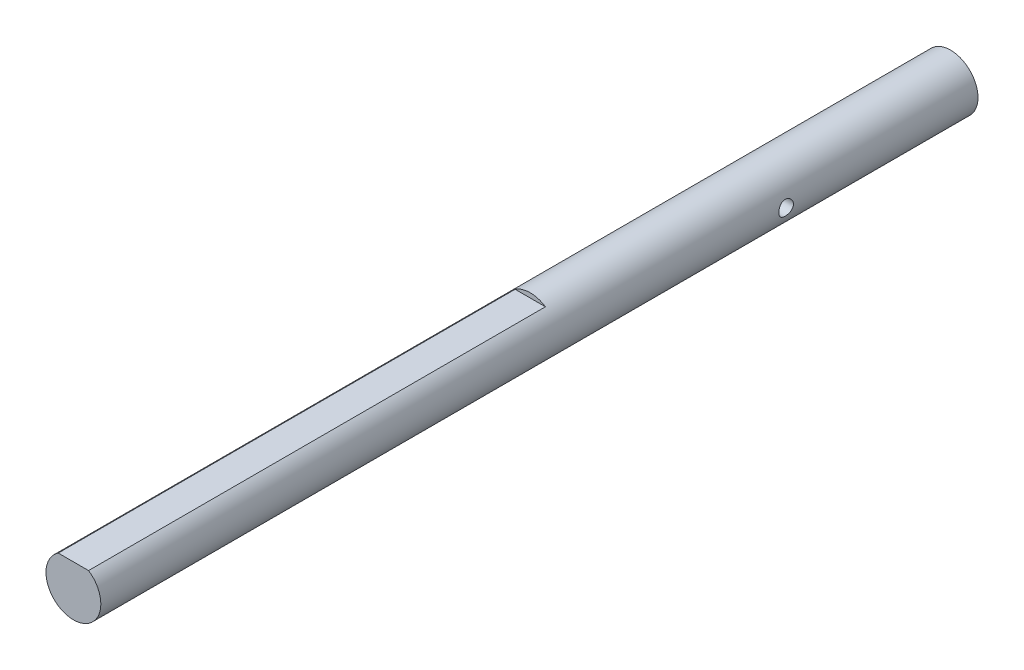
ISO-10303-21;
HEADER;
FILE_DESCRIPTION(('STEP AP214'),'2;1');
FILE_NAME('part.step','',(''),(''),'','','');
FILE_SCHEMA(('AUTOMOTIVE_DESIGN { 1 0 10303 214 1 1 1 1 }'));
ENDSEC;
DATA;
#1=APPLICATION_CONTEXT('core data for automotive mechanical design processes');
#2=APPLICATION_PROTOCOL_DEFINITION('international standard','automotive_design',2000,#1);
#3=PRODUCT_CONTEXT('',#1,'mechanical');
#4=PRODUCT('Part','Part','',(#3));
#5=PRODUCT_RELATED_PRODUCT_CATEGORY('part','',(#4));
#6=PRODUCT_DEFINITION_FORMATION('','',#4);
#7=PRODUCT_DEFINITION_CONTEXT('part definition',#1,'design');
#8=PRODUCT_DEFINITION('design','',#6,#7);
#9=PRODUCT_DEFINITION_SHAPE('','',#8);
#10=(LENGTH_UNIT() NAMED_UNIT(*) SI_UNIT(.MILLI.,.METRE.));
#11=(NAMED_UNIT(*) PLANE_ANGLE_UNIT() SI_UNIT($,.RADIAN.));
#12=(NAMED_UNIT(*) SI_UNIT($,.STERADIAN.) SOLID_ANGLE_UNIT());
#13=UNCERTAINTY_MEASURE_WITH_UNIT(LENGTH_MEASURE(1.E-05),#10,'distance_accuracy_value','');
#14=(GEOMETRIC_REPRESENTATION_CONTEXT(3) GLOBAL_UNCERTAINTY_ASSIGNED_CONTEXT((#13)) GLOBAL_UNIT_ASSIGNED_CONTEXT((#10,
#11,#12)) REPRESENTATION_CONTEXT('',''));
#15=CARTESIAN_POINT('',(0.,0.,0.));
#16=DIRECTION('',(0.,0.,1.));
#17=DIRECTION('',(1.,0.,0.));
#18=AXIS2_PLACEMENT_3D('',#15,#16,#17);
#19=CARTESIAN_POINT('',(0.,0.,-304.8));
#20=DIRECTION('',(0.,0.,1.));
#21=DIRECTION('',(1.,0.,0.));
#22=AXIS2_PLACEMENT_3D('',#19,#20,#21);
#23=CYLINDRICAL_SURFACE('',#22,9.525);
#24=CARTESIAN_POINT('',(-9.525,0.,-240.665));
#25=CARTESIAN_POINT('',(-9.52499788938906,-0.140023285907723,-240.664996676493));
#26=CARTESIAN_POINT('',(-9.52188197425932,-0.280082193481732,-240.653382529979));
#27=CARTESIAN_POINT('',(-9.50975458499507,-0.556165323220162,-240.607315036962));
#28=CARTESIAN_POINT('',(-9.50074027372385,-0.692187570815235,-240.572850699379));
#29=CARTESIAN_POINT('',(-9.47781103231044,-0.956172318087541,-240.482282983083));
#30=CARTESIAN_POINT('',(-9.46390242255576,-1.0841449627894,-240.426207503664));
#31=CARTESIAN_POINT('',(-9.43265447922631,-1.32886918171867,-240.294112701813));
#32=CARTESIAN_POINT('',(-9.41531491704878,-1.44562000747101,-240.218092050334));
#33=CARTESIAN_POINT('',(-9.37862760925533,-1.66729346974982,-240.046403934155));
#34=CARTESIAN_POINT('',(-9.35924553951925,-1.77191884612574,-239.95035999163));
#35=CARTESIAN_POINT('',(-9.32087810293081,-1.9637846634901,-239.74215642651));
#36=CARTESIAN_POINT('',(-9.30189278742998,-2.05102286639492,-239.629994732426));
#37=CARTESIAN_POINT('',(-9.26611732579753,-2.20708739739135,-239.390366741772));
#38=CARTESIAN_POINT('',(-9.24937048475314,-2.27557174725336,-239.262670663108));
#39=CARTESIAN_POINT('',(-9.22047276194098,-2.3899818605778,-238.997058058913));
#40=CARTESIAN_POINT('',(-9.20832103281647,-2.43591178363236,-238.859143423339));
#41=CARTESIAN_POINT('',(-9.19034377069047,-2.50287688687658,-238.580300666962));
#42=CARTESIAN_POINT('',(-9.18438152720593,-2.52445101210757,-238.439511004288));
#43=CARTESIAN_POINT('',(-9.17904985263791,-2.54377234076389,-238.156194142201));
#44=CARTESIAN_POINT('',(-9.17967918968346,-2.54152399626305,-238.013667272419));
#45=CARTESIAN_POINT('',(-9.18733721078579,-2.51369207703426,-237.735128522475));
#46=CARTESIAN_POINT('',(-9.19418704099645,-2.48876065702249,-237.599045778811));
#47=CARTESIAN_POINT('',(-9.21322786612474,-2.4173148087717,-237.333068215241));
#48=CARTESIAN_POINT('',(-9.22541928791818,-2.37079865556101,-237.203173890804));
#49=CARTESIAN_POINT('',(-9.2539269042045,-2.25697233345874,-236.951560457363));
#50=CARTESIAN_POINT('',(-9.27028807379753,-2.18943353244986,-236.829950089107));
#51=CARTESIAN_POINT('',(-9.30526751645905,-2.03563859856197,-236.599559618259));
#52=CARTESIAN_POINT('',(-9.32388623351087,-1.94937878124798,-236.490782047771));
#53=CARTESIAN_POINT('',(-9.36202738499927,-1.75725591224541,-236.285418973232));
#54=CARTESIAN_POINT('',(-9.38155948790815,-1.6508452216494,-236.18934687574));
#55=CARTESIAN_POINT('',(-9.41878204220921,-1.4231844386221,-236.016306248955));
#56=CARTESIAN_POINT('',(-9.43647242100464,-1.30193376164047,-235.939338472548));
#57=CARTESIAN_POINT('',(-9.46812711905832,-1.04723978448177,-235.806465263413));
#58=CARTESIAN_POINT('',(-9.48207492498621,-0.913745826240774,-235.75065274153));
#59=CARTESIAN_POINT('',(-9.50455356389269,-0.638812913875803,-235.662410070207));
#60=CARTESIAN_POINT('',(-9.51308558051861,-0.497375703148972,-235.629974811341));
#61=CARTESIAN_POINT('',(-9.52359231369148,-0.214952685594806,-235.590213506314));
#62=CARTESIAN_POINT('',(-9.52574926788118,-0.0740717818045559,-235.582189439389));
#63=CARTESIAN_POINT('',(-9.52378679048453,0.207022758294517,-235.589550618594));
#64=CARTESIAN_POINT('',(-9.51966800762049,0.347236462068877,-235.604933445154));
#65=CARTESIAN_POINT('',(-9.50573455079945,0.620525111375258,-235.658099228274));
#66=CARTESIAN_POINT('',(-9.49601893713836,0.753681312075287,-235.695492852671));
#67=CARTESIAN_POINT('',(-9.47199394515559,1.01181785339361,-235.791166649525));
#68=CARTESIAN_POINT('',(-9.45768406905135,1.13679730630435,-235.849449085338));
#69=CARTESIAN_POINT('',(-9.42563088910591,1.37774486282828,-235.986540836719));
#70=CARTESIAN_POINT('',(-9.40782581988256,1.49348848934568,-236.065729882833));
#71=CARTESIAN_POINT('',(-9.37084044504306,1.71028948695436,-236.241909570301));
#72=CARTESIAN_POINT('',(-9.35165986824099,1.81134395007495,-236.338903727903));
#73=CARTESIAN_POINT('',(-9.31341477250563,1.9988393408804,-236.551197683418));
#74=CARTESIAN_POINT('',(-9.29436878014651,2.08478779447261,-236.666936572972));
#75=CARTESIAN_POINT('',(-9.2591438792264,2.23605332805101,-236.911597164046));
#76=CARTESIAN_POINT('',(-9.24296485106674,2.30137126875155,-237.0405183153));
#77=CARTESIAN_POINT('',(-9.21549170831837,2.40903012714347,-237.307241039987));
#78=CARTESIAN_POINT('',(-9.20416940355908,2.45150401562476,-237.44498588101));
#79=CARTESIAN_POINT('',(-9.18768577918999,2.5125833050091,-237.726015935985));
#80=CARTESIAN_POINT('',(-9.18252288515124,2.53119480555323,-237.869299724436));
#81=CARTESIAN_POINT('',(-9.17907415579718,2.54367016860078,-238.152298380626));
#82=CARTESIAN_POINT('',(-9.18056835028339,2.53832557634305,-238.291976196764));
#83=CARTESIAN_POINT('',(-9.18975042917709,2.50487657519907,-238.568361462825));
#84=CARTESIAN_POINT('',(-9.19743815420146,2.47677275199435,-238.705068989091));
#85=CARTESIAN_POINT('',(-9.21801015290781,2.39906194938868,-238.970636805193));
#86=CARTESIAN_POINT('',(-9.23085383982424,2.34962269566052,-239.099549540267));
#87=CARTESIAN_POINT('',(-9.26029159025469,2.23077474294162,-239.347348114782));
#88=CARTESIAN_POINT('',(-9.27688624197102,2.16136291151244,-239.466232377603));
#89=CARTESIAN_POINT('',(-9.31256610231475,2.00214114771415,-239.69437755656));
#90=CARTESIAN_POINT('',(-9.33171023039707,1.91179106805249,-239.80325233942));
#91=CARTESIAN_POINT('',(-9.37000289803859,1.71428477959091,-240.004552313618));
#92=CARTESIAN_POINT('',(-9.38915143753868,1.60712449003559,-240.09697349911));
#93=CARTESIAN_POINT('',(-9.42578521753195,1.37627357598264,-240.264686141811));
#94=CARTESIAN_POINT('',(-9.4432261136952,1.25227837142475,-240.339568863525));
#95=CARTESIAN_POINT('',(-9.47399438830639,0.992998573329435,-240.46730851823));
#96=CARTESIAN_POINT('',(-9.48732440458155,0.857721290264285,-240.520179583093));
#97=CARTESIAN_POINT('',(-9.50664535692112,0.602455875198851,-240.595499612478));
#98=CARTESIAN_POINT('',(-9.51347818652606,0.483567761037591,-240.621501717162));
#99=CARTESIAN_POINT('',(-9.52265620276297,0.243128540052685,-240.656252501832));
#100=CARTESIAN_POINT('',(-9.52500183257532,0.121577697414171,-240.665002885694));
#101=CARTESIAN_POINT('',(-9.525,0.,-240.665));
#102=B_SPLINE_CURVE_WITH_KNOTS('',3,(#24,#25,#26,#27,#28,#29,#30,#31,#32,#33,#34,#35,#36,#37,
#38,#39,#40,#41,#42,#43,#44,#45,#46,#47,#48,#49,#50,#51,#52,#53,#54,#55,#56,#57,#58,#59,#60,#61,
#62,#63,#64,#65,#66,#67,#68,#69,#70,#71,#72,#73,#74,#75,#76,#77,#78,#79,#80,#81,#82,#83,#84,#85,
#86,#87,#88,#89,#90,#91,#92,#93,#94,#95,#96,#97,#98,#99,#100,#101),.UNSPECIFIED.,.T.,.F.,(4,2,2,
2,2,2,2,2,2,2,2,2,2,2,2,2,2,2,2,2,2,2,2,2,2,2,2,2,2,2,2,2,2,2,2,2,2,2,4),(0.,0.419624000665947,
0.839449989577031,1.25873580227435,1.67804956120016,2.10610320402809,2.53421191054938,
2.96967379804498,3.40505534544713,3.83060140978093,4.25606794713484,4.66967572598414,
5.08331656452428,5.50162315150048,5.92001213909384,6.35204799961641,6.78410088360741,
7.21802988195856,7.6518640103147,8.07317051256168,8.49443346735189,8.90845990265482,
9.32253121235023,9.74471363225769,10.1669795168878,10.6011535040613,11.0353093749061,
11.4669099807821,11.8984002400325,12.3157404485492,12.7330699176571,13.147176721239,
13.5613485075077,13.9877081126022,14.4141713790676,14.8497576040129,15.2850637420893,
15.6494457012609,16.0137916702186),.UNSPECIFIED.);
#103=CARTESIAN_POINT('',(-9.525,0.,-240.665));
#104=VERTEX_POINT('',#103);
#105=EDGE_CURVE('E13',#104,#104,#102,.T.);
#106=ORIENTED_EDGE('',*,*,#105,.F.);
#107=EDGE_LOOP('',(#106));
#108=FACE_BOUND('',#107,.T.);
#109=CARTESIAN_POINT('',(9.525,0.,-240.665));
#110=CARTESIAN_POINT('',(9.52499788938906,0.140023285907723,-240.664996676493));
#111=CARTESIAN_POINT('',(9.52188197425932,0.280082193481732,-240.653382529979));
#112=CARTESIAN_POINT('',(9.50975458499507,0.556165323220162,-240.607315036962));
#113=CARTESIAN_POINT('',(9.50074027372385,0.692187570815235,-240.572850699379));
#114=CARTESIAN_POINT('',(9.47781103231044,0.956172318087541,-240.482282983083));
#115=CARTESIAN_POINT('',(9.46390242255576,1.0841449627894,-240.426207503664));
#116=CARTESIAN_POINT('',(9.43265447922631,1.32886918171867,-240.294112701813));
#117=CARTESIAN_POINT('',(9.41531491704878,1.44562000747101,-240.218092050334));
#118=CARTESIAN_POINT('',(9.37862760925533,1.66729346974982,-240.046403934155));
#119=CARTESIAN_POINT('',(9.35924553951925,1.77191884612574,-239.95035999163));
#120=CARTESIAN_POINT('',(9.32087810293081,1.9637846634901,-239.74215642651));
#121=CARTESIAN_POINT('',(9.30189278742998,2.05102286639492,-239.629994732426));
#122=CARTESIAN_POINT('',(9.26611732579753,2.20708739739135,-239.390366741772));
#123=CARTESIAN_POINT('',(9.24937048475314,2.27557174725336,-239.262670663108));
#124=CARTESIAN_POINT('',(9.22047276194098,2.3899818605778,-238.997058058913));
#125=CARTESIAN_POINT('',(9.20832103281647,2.43591178363236,-238.859143423339));
#126=CARTESIAN_POINT('',(9.19034377069047,2.50287688687658,-238.580300666962));
#127=CARTESIAN_POINT('',(9.18438152720593,2.52445101210757,-238.439511004288));
#128=CARTESIAN_POINT('',(9.17904985263791,2.54377234076389,-238.156194142201));
#129=CARTESIAN_POINT('',(9.17967918968346,2.54152399626305,-238.013667272419));
#130=CARTESIAN_POINT('',(9.18733721078579,2.51369207703426,-237.735128522475));
#131=CARTESIAN_POINT('',(9.19418704099645,2.48876065702249,-237.599045778811));
#132=CARTESIAN_POINT('',(9.21322786612474,2.4173148087717,-237.333068215241));
#133=CARTESIAN_POINT('',(9.22541928791818,2.37079865556101,-237.203173890804));
#134=CARTESIAN_POINT('',(9.2539269042045,2.25697233345874,-236.951560457363));
#135=CARTESIAN_POINT('',(9.27028807379753,2.18943353244986,-236.829950089107));
#136=CARTESIAN_POINT('',(9.30526751645905,2.03563859856197,-236.599559618259));
#137=CARTESIAN_POINT('',(9.32388623351087,1.94937878124798,-236.490782047771));
#138=CARTESIAN_POINT('',(9.36202738499927,1.75725591224541,-236.285418973232));
#139=CARTESIAN_POINT('',(9.38155948790815,1.6508452216494,-236.18934687574));
#140=CARTESIAN_POINT('',(9.41878204220921,1.4231844386221,-236.016306248955));
#141=CARTESIAN_POINT('',(9.43647242100464,1.30193376164047,-235.939338472548));
#142=CARTESIAN_POINT('',(9.46812711905832,1.04723978448177,-235.806465263413));
#143=CARTESIAN_POINT('',(9.48207492498621,0.913745826240774,-235.75065274153));
#144=CARTESIAN_POINT('',(9.50455356389269,0.638812913875803,-235.662410070207));
#145=CARTESIAN_POINT('',(9.51308558051861,0.497375703148972,-235.629974811341));
#146=CARTESIAN_POINT('',(9.52359231369148,0.214952685594806,-235.590213506314));
#147=CARTESIAN_POINT('',(9.52574926788118,0.0740717818045559,-235.582189439389));
#148=CARTESIAN_POINT('',(9.52378679048453,-0.207022758294517,-235.589550618594));
#149=CARTESIAN_POINT('',(9.51966800762049,-0.347236462068877,-235.604933445154));
#150=CARTESIAN_POINT('',(9.50573455079945,-0.620525111375258,-235.658099228274));
#151=CARTESIAN_POINT('',(9.49601893713836,-0.753681312075287,-235.695492852671));
#152=CARTESIAN_POINT('',(9.47199394515559,-1.01181785339361,-235.791166649525));
#153=CARTESIAN_POINT('',(9.45768406905135,-1.13679730630435,-235.849449085338));
#154=CARTESIAN_POINT('',(9.42563088910591,-1.37774486282828,-235.986540836719));
#155=CARTESIAN_POINT('',(9.40782581988256,-1.49348848934568,-236.065729882833));
#156=CARTESIAN_POINT('',(9.37084044504306,-1.71028948695436,-236.241909570301));
#157=CARTESIAN_POINT('',(9.35165986824099,-1.81134395007495,-236.338903727903));
#158=CARTESIAN_POINT('',(9.31341477250563,-1.9988393408804,-236.551197683418));
#159=CARTESIAN_POINT('',(9.29436878014651,-2.08478779447261,-236.666936572972));
#160=CARTESIAN_POINT('',(9.2591438792264,-2.23605332805101,-236.911597164046));
#161=CARTESIAN_POINT('',(9.24296485106674,-2.30137126875155,-237.0405183153));
#162=CARTESIAN_POINT('',(9.21549170831837,-2.40903012714347,-237.307241039987));
#163=CARTESIAN_POINT('',(9.20416940355908,-2.45150401562476,-237.44498588101));
#164=CARTESIAN_POINT('',(9.18768577918999,-2.5125833050091,-237.726015935985));
#165=CARTESIAN_POINT('',(9.18252288515124,-2.53119480555323,-237.869299724436));
#166=CARTESIAN_POINT('',(9.17907415579718,-2.54367016860078,-238.152298380626));
#167=CARTESIAN_POINT('',(9.18056835028339,-2.53832557634305,-238.291976196764));
#168=CARTESIAN_POINT('',(9.18975042917709,-2.50487657519907,-238.568361462825));
#169=CARTESIAN_POINT('',(9.19743815420146,-2.47677275199435,-238.705068989091));
#170=CARTESIAN_POINT('',(9.21801015290781,-2.39906194938868,-238.970636805193));
#171=CARTESIAN_POINT('',(9.23085383982424,-2.34962269566052,-239.099549540267));
#172=CARTESIAN_POINT('',(9.26029159025469,-2.23077474294162,-239.347348114782));
#173=CARTESIAN_POINT('',(9.27688624197102,-2.16136291151244,-239.466232377603));
#174=CARTESIAN_POINT('',(9.31256610231475,-2.00214114771415,-239.69437755656));
#175=CARTESIAN_POINT('',(9.33171023039707,-1.91179106805249,-239.80325233942));
#176=CARTESIAN_POINT('',(9.37000289803859,-1.71428477959091,-240.004552313618));
#177=CARTESIAN_POINT('',(9.38915143753868,-1.60712449003559,-240.09697349911));
#178=CARTESIAN_POINT('',(9.42578521753195,-1.37627357598264,-240.264686141811));
#179=CARTESIAN_POINT('',(9.4432261136952,-1.25227837142475,-240.339568863525));
#180=CARTESIAN_POINT('',(9.47399438830639,-0.992998573329435,-240.46730851823));
#181=CARTESIAN_POINT('',(9.48732440458155,-0.857721290264285,-240.520179583093));
#182=CARTESIAN_POINT('',(9.50664535692112,-0.602455875198851,-240.595499612478));
#183=CARTESIAN_POINT('',(9.51347818652606,-0.483567761037591,-240.621501717162));
#184=CARTESIAN_POINT('',(9.52265620276297,-0.243128540052685,-240.656252501832));
#185=CARTESIAN_POINT('',(9.52500183257532,-0.121577697414171,-240.665002885694));
#186=CARTESIAN_POINT('',(9.525,0.,-240.665));
#187=B_SPLINE_CURVE_WITH_KNOTS('',3,(#109,#110,#111,#112,#113,#114,#115,#116,#117,#118,#119,
#120,#121,#122,#123,#124,#125,#126,#127,#128,#129,#130,#131,#132,#133,#134,#135,#136,#137,#138,
#139,#140,#141,#142,#143,#144,#145,#146,#147,#148,#149,#150,#151,#152,#153,#154,#155,#156,#157,
#158,#159,#160,#161,#162,#163,#164,#165,#166,#167,#168,#169,#170,#171,#172,#173,#174,#175,#176,
#177,#178,#179,#180,#181,#182,#183,#184,#185,#186),.UNSPECIFIED.,.T.,.F.,(4,2,2,2,2,2,2,2,2,2,2,
2,2,2,2,2,2,2,2,2,2,2,2,2,2,2,2,2,2,2,2,2,2,2,2,2,2,2,4),(0.,0.419624000665947,
0.839449989577031,1.25873580227435,1.67804956120016,2.10610320402809,2.53421191054938,
2.96967379804498,3.40505534544713,3.83060140978093,4.25606794713484,4.66967572598414,
5.08331656452428,5.50162315150048,5.92001213909384,6.35204799961641,6.78410088360741,
7.21802988195856,7.6518640103147,8.07317051256168,8.49443346735189,8.90845990265482,
9.32253121235023,9.74471363225769,10.1669795168878,10.6011535040613,11.0353093749061,
11.4669099807821,11.8984002400325,12.3157404485492,12.7330699176571,13.147176721239,
13.5613485075077,13.9877081126022,14.4141713790676,14.8497576040129,15.2850637420893,
15.6494457012609,16.0137916702186),.UNSPECIFIED.);
#188=CARTESIAN_POINT('',(9.525,0.,-240.665));
#189=VERTEX_POINT('',#188);
#190=EDGE_CURVE('E58',#189,#189,#187,.T.);
#191=ORIENTED_EDGE('',*,*,#190,.F.);
#192=EDGE_LOOP('',(#191));
#193=FACE_BOUND('',#192,.T.);
#194=DIRECTION('',(0.,0.,1.));
#195=VECTOR('',#194,1.);
#196=CARTESIAN_POINT('',(5.2651418546892,7.9375,-304.8));
#197=LINE('',#196,#195);
#198=CARTESIAN_POINT('',(5.2651418546892,7.9375,0.));
#199=VERTEX_POINT('',#198);
#200=CARTESIAN_POINT('',(5.26514185468919,7.9375,-158.75));
#201=VERTEX_POINT('',#200);
#202=EDGE_CURVE('E70',#199,#201,#197,.F.);
#203=ORIENTED_EDGE('',*,*,#202,.F.);
#204=CARTESIAN_POINT('',(0.,0.,0.));
#205=DIRECTION('',(0.,0.,1.));
#206=DIRECTION('',(1.,0.,0.));
#207=AXIS2_PLACEMENT_3D('',#204,#205,#206);
#208=CIRCLE('',#207,9.525);
#209=CARTESIAN_POINT('',(-5.26514185468919,7.9375,0.));
#210=VERTEX_POINT('',#209);
#211=EDGE_CURVE('E87',#210,#199,#208,.T.);
#212=ORIENTED_EDGE('',*,*,#211,.F.);
#213=DIRECTION('',(0.,0.,1.));
#214=VECTOR('',#213,1.);
#215=CARTESIAN_POINT('',(-5.2651418546892,7.9375,-304.8));
#216=LINE('',#215,#214);
#217=CARTESIAN_POINT('',(-5.26514185468919,7.9375,-158.75));
#218=VERTEX_POINT('',#217);
#219=EDGE_CURVE('E65',#218,#210,#216,.T.);
#220=ORIENTED_EDGE('',*,*,#219,.F.);
#221=CARTESIAN_POINT('',(0.,0.,-158.75));
#222=DIRECTION('',(0.,0.,1.));
#223=DIRECTION('',(1.,0.,0.));
#224=AXIS2_PLACEMENT_3D('',#221,#222,#223);
#225=CIRCLE('',#224,9.525);
#226=EDGE_CURVE('E81',#218,#201,#225,.F.);
#227=ORIENTED_EDGE('',*,*,#226,.T.);
#228=EDGE_LOOP('',(#203,#212,#220,#227));
#229=FACE_BOUND('',#228,.T.);
#230=CARTESIAN_POINT('',(0.,0.,-304.8));
#231=DIRECTION('',(0.,0.,1.));
#232=DIRECTION('',(1.,0.,0.));
#233=AXIS2_PLACEMENT_3D('',#230,#231,#232);
#234=CIRCLE('',#233,9.525);
#235=CARTESIAN_POINT('',(9.525,0.,-304.8));
#236=VERTEX_POINT('',#235);
#237=EDGE_CURVE('E82',#236,#236,#234,.T.);
#238=ORIENTED_EDGE('',*,*,#237,.T.);
#239=EDGE_LOOP('',(#238));
#240=FACE_BOUND('',#239,.T.);
#241=ADVANCED_FACE('F47',(#108,#193,#229,#240),#23,.T.);
#242=CARTESIAN_POINT('',(0.,0.,-304.8));
#243=DIRECTION('',(0.,0.,1.));
#244=DIRECTION('',(1.,0.,0.));
#245=AXIS2_PLACEMENT_3D('',#242,#243,#244);
#246=PLANE('',#245);
#247=ORIENTED_EDGE('',*,*,#237,.F.);
#248=EDGE_LOOP('',(#247));
#249=FACE_BOUND('',#248,.T.);
#250=ADVANCED_FACE('F109',(#249),#246,.F.);
#251=CARTESIAN_POINT('',(0.,0.,0.));
#252=DIRECTION('',(0.,0.,1.));
#253=DIRECTION('',(1.,0.,0.));
#254=AXIS2_PLACEMENT_3D('',#251,#252,#253);
#255=PLANE('',#254);
#256=DIRECTION('',(1.,0.,0.));
#257=VECTOR('',#256,1.);
#258=CARTESIAN_POINT('',(0.,7.9375,0.));
#259=LINE('',#258,#257);
#260=EDGE_CURVE('E76',#210,#199,#259,.T.);
#261=ORIENTED_EDGE('',*,*,#260,.F.);
#262=ORIENTED_EDGE('',*,*,#211,.T.);
#263=EDGE_LOOP('',(#261,#262));
#264=FACE_BOUND('',#263,.T.);
#265=ADVANCED_FACE('F89',(#264),#255,.T.);
#266=CARTESIAN_POINT('',(-11.6498073437701,7.9375,-158.75));
#267=DIRECTION('',(0.,-1.,0.));
#268=DIRECTION('',(0.,0.,-1.));
#269=AXIS2_PLACEMENT_3D('',#266,#267,#268);
#270=PLANE('',#269);
#271=ORIENTED_EDGE('',*,*,#202,.T.);
#272=DIRECTION('',(1.,0.,0.));
#273=VECTOR('',#272,1.);
#274=CARTESIAN_POINT('',(-11.6498073437701,7.9375,-158.75));
#275=LINE('',#274,#273);
#276=EDGE_CURVE('E156',#218,#201,#275,.T.);
#277=ORIENTED_EDGE('',*,*,#276,.F.);
#278=ORIENTED_EDGE('',*,*,#219,.T.);
#279=ORIENTED_EDGE('',*,*,#260,.T.);
#280=EDGE_LOOP('',(#271,#277,#278,#279));
#281=FACE_BOUND('',#280,.T.);
#282=ADVANCED_FACE('F77',(#281),#270,.F.);
#283=CARTESIAN_POINT('',(0.,0.,-158.75));
#284=DIRECTION('',(0.,0.,1.));
#285=DIRECTION('',(1.,0.,0.));
#286=AXIS2_PLACEMENT_3D('',#283,#284,#285);
#287=PLANE('',#286);
#288=ORIENTED_EDGE('',*,*,#276,.T.);
#289=ORIENTED_EDGE('',*,*,#226,.F.);
#290=EDGE_LOOP('',(#288,#289));
#291=FACE_BOUND('',#290,.T.);
#292=ADVANCED_FACE('F101',(#291),#287,.T.);
#293=CARTESIAN_POINT('',(-9.525,0.,-238.125));
#294=DIRECTION('',(1.,0.,0.));
#295=DIRECTION('',(0.,0.,-1.));
#296=AXIS2_PLACEMENT_3D('',#293,#294,#295);
#297=CYLINDRICAL_SURFACE('',#296,2.53999999999998);
#298=ORIENTED_EDGE('',*,*,#105,.T.);
#299=EDGE_LOOP('',(#298));
#300=FACE_BOUND('',#299,.T.);
#301=ORIENTED_EDGE('',*,*,#190,.T.);
#302=EDGE_LOOP('',(#301));
#303=FACE_BOUND('',#302,.T.);
#304=ADVANCED_FACE('F97',(#300,#303),#297,.F.);
#305=CLOSED_SHELL('',(#241,#250,#265,#282,#292,#304));
#306=MANIFOLD_SOLID_BREP('B2',#305);
#307=ADVANCED_BREP_SHAPE_REPRESENTATION('',(#18,#306),#14);
#308=SHAPE_DEFINITION_REPRESENTATION(#9,#307);
ENDSEC;
END-ISO-10303-21;
